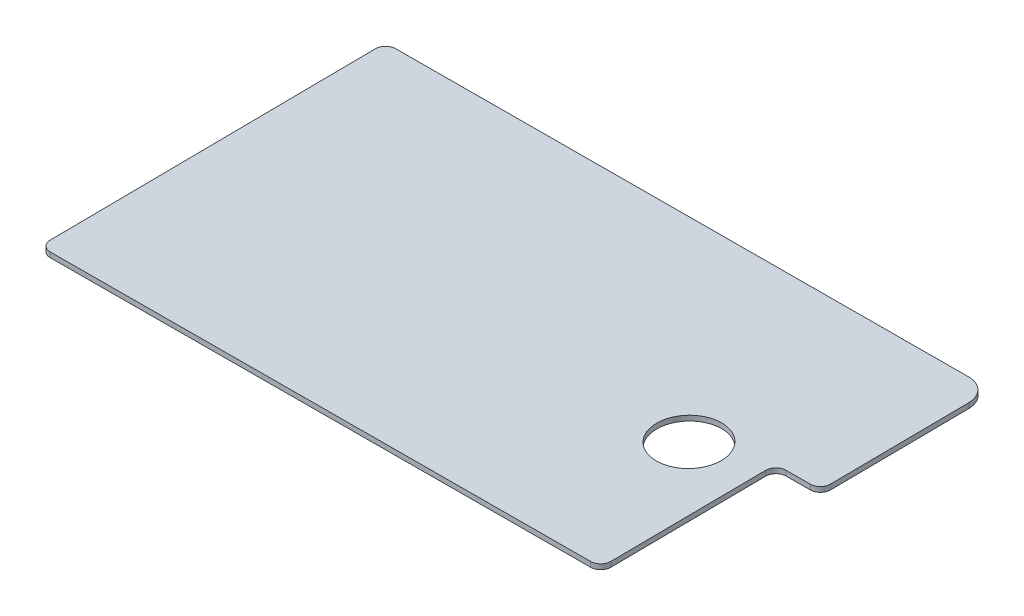
ISO-10303-21;
HEADER;
FILE_DESCRIPTION(('STEP AP214'),'2;1');
FILE_NAME('part.step','',(''),(''),'','','');
FILE_SCHEMA(('AUTOMOTIVE_DESIGN { 1 0 10303 214 1 1 1 1 }'));
ENDSEC;
DATA;
#1=APPLICATION_CONTEXT('core data for automotive mechanical design processes');
#2=APPLICATION_PROTOCOL_DEFINITION('international standard','automotive_design',2000,#1);
#3=PRODUCT_CONTEXT('',#1,'mechanical');
#4=PRODUCT('Part','Part','',(#3));
#5=PRODUCT_RELATED_PRODUCT_CATEGORY('part','',(#4));
#6=PRODUCT_DEFINITION_FORMATION('','',#4);
#7=PRODUCT_DEFINITION_CONTEXT('part definition',#1,'design');
#8=PRODUCT_DEFINITION('design','',#6,#7);
#9=PRODUCT_DEFINITION_SHAPE('','',#8);
#10=(LENGTH_UNIT() NAMED_UNIT(*) SI_UNIT(.MILLI.,.METRE.));
#11=(NAMED_UNIT(*) PLANE_ANGLE_UNIT() SI_UNIT($,.RADIAN.));
#12=(NAMED_UNIT(*) SI_UNIT($,.STERADIAN.) SOLID_ANGLE_UNIT());
#13=UNCERTAINTY_MEASURE_WITH_UNIT(LENGTH_MEASURE(1.E-05),#10,'distance_accuracy_value','');
#14=(GEOMETRIC_REPRESENTATION_CONTEXT(3) GLOBAL_UNCERTAINTY_ASSIGNED_CONTEXT((#13)) GLOBAL_UNIT_ASSIGNED_CONTEXT((#10,
#11,#12)) REPRESENTATION_CONTEXT('',''));
#15=CARTESIAN_POINT('',(0.,0.,0.));
#16=DIRECTION('',(0.,0.,1.));
#17=DIRECTION('',(1.,0.,0.));
#18=AXIS2_PLACEMENT_3D('',#15,#16,#17);
#19=CARTESIAN_POINT('',(179.345770116146,-1563.79459300671,-76.0416352237844));
#20=DIRECTION('',(-0.00401035269300453,0.999946047931856,0.00958218642790401));
#21=DIRECTION('',(-0.388528792529135,-0.0103875139856904,0.921378031499042));
#22=AXIS2_PLACEMENT_3D('',#19,#20,#21);
#23=PLANE('',#22);
#24=DIRECTION('',(-0.999991958318706,-0.00401035269300453,-1.92144919036807E-05));
#25=VECTOR('',#24,1.);
#26=CARTESIAN_POINT('',(236.14693968438,-1565.12535482206,86.6021155602221));
#27=LINE('',#26,#25);
#28=CARTESIAN_POINT('',(236.14693968438,-1565.12535482206,86.6021155602221));
#29=VERTEX_POINT('',#28);
#30=CARTESIAN_POINT('',(-101.670343674846,-1566.48013216881,86.5956245205672));
#31=VERTEX_POINT('',#30);
#32=EDGE_CURVE('E43',#29,#31,#27,.T.);
#33=ORIENTED_EDGE('',*,*,#32,.F.);
#34=CARTESIAN_POINT('',(236.146817672356,-1565.06450793824,80.2524070911787));
#35=DIRECTION('',(-0.00401035269300453,0.999946047931856,0.00958218642790401));
#36=DIRECTION('',(0.,-0.00958226348364413,0.999954089059358));
#37=AXIS2_PLACEMENT_3D('',#34,#35,#36);
#38=CIRCLE('',#37,6.34999999999994);
#39=CARTESIAN_POINT('',(242.49676660768,-1565.03904219864,80.2525291032023));
#40=VERTEX_POINT('',#39);
#41=EDGE_CURVE('E157',#29,#40,#38,.T.);
#42=ORIENTED_EDGE('',*,*,#41,.T.);
#43=DIRECTION('',(-1.92144919035644E-05,0.00958218642790401,-0.99995408961315));
#44=VECTOR('',#43,1.);
#45=CARTESIAN_POINT('',(242.49676660768,-1565.03904219864,80.2525291032023));
#46=LINE('',#45,#44);
#47=CARTESIAN_POINT('',(242.494909992659,-1564.11315608374,-16.3688019553789));
#48=VERTEX_POINT('',#47);
#49=EDGE_CURVE('E159',#40,#48,#46,.T.);
#50=ORIENTED_EDGE('',*,*,#49,.T.);
#51=CARTESIAN_POINT('',(248.844858927982,-1564.08769034414,-16.3686799433554));
#52=DIRECTION('',(-0.00401035269300453,0.999946047931856,0.00958218642790401));
#53=DIRECTION('',(0.,-0.00958226348364413,0.999954089059358));
#54=AXIS2_PLACEMENT_3D('',#51,#52,#53);
#55=CIRCLE('',#54,6.35000000000001);
#56=CARTESIAN_POINT('',(248.844736915959,-1564.02684346032,-22.7183884123989));
#57=VERTEX_POINT('',#56);
#58=EDGE_CURVE('E162',#48,#57,#55,.F.);
#59=ORIENTED_EDGE('',*,*,#58,.T.);
#60=DIRECTION('',(0.999991958318706,0.00401035269300454,1.92144919033824E-05));
#61=VECTOR('',#60,1.);
#62=CARTESIAN_POINT('',(248.844736915959,-1564.02684346032,-22.7183884123989));
#63=LINE('',#62,#61);
#64=CARTESIAN_POINT('',(264.084614360736,-1563.96572568528,-22.7180955835422));
#65=VERTEX_POINT('',#64);
#66=EDGE_CURVE('E164',#57,#65,#63,.T.);
#67=ORIENTED_EDGE('',*,*,#66,.T.);
#68=CARTESIAN_POINT('',(264.084492348712,-1563.90487880146,-29.0678040525857));
#69=DIRECTION('',(-0.00401035269300453,0.999946047931856,0.00958218642790401));
#70=DIRECTION('',(0.,-0.00958226348364413,0.999954089059358));
#71=AXIS2_PLACEMENT_3D('',#68,#69,#70);
#72=CIRCLE('',#71,6.35000000000001);
#73=CARTESIAN_POINT('',(270.434441284036,-1563.87941306186,-29.0676820405622));
#74=VERTEX_POINT('',#73);
#75=EDGE_CURVE('E166',#65,#74,#72,.T.);
#76=ORIENTED_EDGE('',*,*,#75,.T.);
#77=DIRECTION('',(1.92144919037876E-05,-0.00958218642790401,0.99995408961315));
#78=VECTOR('',#77,1.);
#79=CARTESIAN_POINT('',(270.432781920515,-1563.05189544195,-115.423717219554));
#80=LINE('',#79,#78);
#81=CARTESIAN_POINT('',(270.432781920515,-1563.05189544195,-115.423717219554));
#82=VERTEX_POINT('',#81);
#83=EDGE_CURVE('E169',#82,#74,#80,.T.);
#84=ORIENTED_EDGE('',*,*,#83,.F.);
#85=CARTESIAN_POINT('',(256.568660597189,-1563.10749590535,-115.423983613743));
#86=DIRECTION('',(-0.00401035269300453,0.999946047931856,0.00958218642790401));
#87=DIRECTION('',(0.,-0.00958226348364413,0.999954089059358));
#88=AXIS2_PLACEMENT_3D('',#85,#86,#87);
#89=CIRCLE('',#88,13.8642328150678);
#90=CARTESIAN_POINT('',(256.568394203,-1562.97464624184,-129.287579916519));
#91=VERTEX_POINT('',#90);
#92=EDGE_CURVE('E174',#91,#82,#89,.F.);
#93=ORIENTED_EDGE('',*,*,#92,.F.);
#94=DIRECTION('',(-0.999991958318706,-0.00401035269300453,-1.9214491903596E-05));
#95=VECTOR('',#94,1.);
#96=CARTESIAN_POINT('',(256.568394203,-1562.97464624184,-129.287579916519));
#97=LINE('',#96,#95);
#98=CARTESIAN_POINT('',(-101.674492083648,-1564.41133811903,-129.294463426912));
#99=VERTEX_POINT('',#98);
#100=EDGE_CURVE('E168',#91,#99,#97,.T.);
#101=ORIENTED_EDGE('',*,*,#100,.T.);
#102=CARTESIAN_POINT('',(-101.674370071624,-1564.47218500284,-122.944754957868));
#103=DIRECTION('',(-0.00401035269300453,0.999946047931856,0.00958218642790401));
#104=DIRECTION('',(0.,-0.00958226348364413,0.999954089059358));
#105=AXIS2_PLACEMENT_3D('',#102,#103,#104);
#106=CIRCLE('',#105,6.34999999999996);
#107=CARTESIAN_POINT('',(-108.024319006948,-1564.49765074245,-122.944876969892));
#108=VERTEX_POINT('',#107);
#109=EDGE_CURVE('E90',#99,#108,#106,.T.);
#110=ORIENTED_EDGE('',*,*,#109,.T.);
#111=DIRECTION('',(1.92144919038638E-05,-0.00958218642790401,0.99995408961315));
#112=VECTOR('',#111,1.);
#113=CARTESIAN_POINT('',(-108.024319006948,-1564.49765074245,-122.944876969892));
#114=LINE('',#113,#112);
#115=CARTESIAN_POINT('',(-108.020414622193,-1566.4447510246,80.2457940395002));
#116=VERTEX_POINT('',#115);
#117=EDGE_CURVE('E95',#108,#116,#114,.T.);
#118=ORIENTED_EDGE('',*,*,#117,.T.);
#119=CARTESIAN_POINT('',(-101.670465686869,-1566.41928528499,80.2459160515237));
#120=DIRECTION('',(-0.00401035269300453,0.999946047931856,0.00958218642790401));
#121=DIRECTION('',(0.,-0.00958226348364413,0.999954089059358));
#122=AXIS2_PLACEMENT_3D('',#119,#120,#121);
#123=CIRCLE('',#122,6.34999999999996);
#124=EDGE_CURVE('E134',#31,#116,#123,.F.);
#125=ORIENTED_EDGE('',*,*,#124,.F.);
#126=EDGE_LOOP('',(#33,#42,#50,#59,#67,#76,#84,#93,#101,#110,#118,#125));
#127=FACE_BOUND('',#126,.T.);
#128=CARTESIAN_POINT('',(202.890853379791,-1564.35154294354,-8.06717227578847));
#129=DIRECTION('',(-0.00401035269300453,0.999946047931856,0.00958218642790401));
#130=DIRECTION('',(0.,-0.00958226348364413,0.999954089059358));
#131=AXIS2_PLACEMENT_3D('',#128,#129,#130);
#132=CIRCLE('',#131,20.32);
#133=CARTESIAN_POINT('',(202.890853379791,-1564.54625453753,12.2518948138977));
#134=VERTEX_POINT('',#133);
#135=EDGE_CURVE('E160',#134,#134,#132,.T.);
#136=ORIENTED_EDGE('',*,*,#135,.F.);
#137=EDGE_LOOP('',(#136));
#138=FACE_BOUND('',#137,.T.);
#139=ADVANCED_FACE('F35',(#127,#138),#23,.T.);
#140=CARTESIAN_POINT('',(-101.657732817069,-1569.59411398718,80.2154926096152));
#141=DIRECTION('',(0.00401035269300462,-0.999946047931856,-0.00958218642790412));
#142=DIRECTION('',(0.,0.00958226348364424,-0.999954089059358));
#143=AXIS2_PLACEMENT_3D('',#140,#141,#142);
#144=PLANE('',#143);
#145=DIRECTION('',(-0.999991958318706,-0.00401035269300463,-1.92144919036816E-05));
#146=VECTOR('',#145,1.);
#147=CARTESIAN_POINT('',(236.15967255418,-1568.30018352424,86.5716921183135));
#148=LINE('',#147,#146);
#149=CARTESIAN_POINT('',(236.15967255418,-1568.30018352424,86.5716921183135));
#150=VERTEX_POINT('',#149);
#151=CARTESIAN_POINT('',(-101.657610805045,-1569.65496087099,86.5652010786586));
#152=VERTEX_POINT('',#151);
#153=EDGE_CURVE('E145',#150,#152,#148,.T.);
#154=ORIENTED_EDGE('',*,*,#153,.T.);
#155=CARTESIAN_POINT('',(-101.657732817069,-1569.59411398718,80.2154926096152));
#156=DIRECTION('',(0.00401035269300462,-0.999946047931856,-0.00958218642790412));
#157=DIRECTION('',(0.,0.00958226348364424,-0.999954089059358));
#158=AXIS2_PLACEMENT_3D('',#155,#156,#157);
#159=CIRCLE('',#158,6.34999999999996);
#160=CARTESIAN_POINT('',(-108.007681752393,-1569.61957972678,80.2153705975916));
#161=VERTEX_POINT('',#160);
#162=EDGE_CURVE('E132',#152,#161,#159,.T.);
#163=ORIENTED_EDGE('',*,*,#162,.T.);
#164=DIRECTION('',(1.92144919038675E-05,-0.00958218642790493,0.99995408961315));
#165=VECTOR('',#164,1.);
#166=CARTESIAN_POINT('',(-108.011586137148,-1567.67247944463,-122.975300411801));
#167=LINE('',#166,#165);
#168=CARTESIAN_POINT('',(-108.011586137148,-1567.67247944463,-122.975300411801));
#169=VERTEX_POINT('',#168);
#170=EDGE_CURVE('E136',#169,#161,#167,.T.);
#171=ORIENTED_EDGE('',*,*,#170,.F.);
#172=CARTESIAN_POINT('',(-101.661637201824,-1567.64701370503,-122.975178399777));
#173=DIRECTION('',(-0.00401035269300462,0.999946047931856,0.00958218642790412));
#174=DIRECTION('',(0.,-0.00958226348364424,0.999954089059358));
#175=AXIS2_PLACEMENT_3D('',#172,#173,#174);
#176=CIRCLE('',#175,6.34999999999996);
#177=CARTESIAN_POINT('',(-101.661759213847,-1567.58616682121,-129.324886868821));
#178=VERTEX_POINT('',#177);
#179=EDGE_CURVE('E199',#178,#169,#176,.T.);
#180=ORIENTED_EDGE('',*,*,#179,.F.);
#181=DIRECTION('',(-0.999991958318706,-0.00401035269300506,-1.9214491903601E-05));
#182=VECTOR('',#181,1.);
#183=CARTESIAN_POINT('',(256.5811270728,-1566.14947494402,-129.318003358427));
#184=LINE('',#183,#182);
#185=CARTESIAN_POINT('',(256.5811270728,-1566.14947494402,-129.318003358427));
#186=VERTEX_POINT('',#185);
#187=EDGE_CURVE('E177',#186,#178,#184,.T.);
#188=ORIENTED_EDGE('',*,*,#187,.F.);
#189=CARTESIAN_POINT('',(256.581393466989,-1566.28232460754,-115.454407055652));
#190=DIRECTION('',(0.00401035269300462,-0.999946047931856,-0.00958218642790412));
#191=DIRECTION('',(0.,0.00958226348364424,-0.999954089059358));
#192=AXIS2_PLACEMENT_3D('',#189,#190,#191);
#193=CIRCLE('',#192,13.8642328150678);
#194=CARTESIAN_POINT('',(270.445514790316,-1566.22672414413,-115.454140661462));
#195=VERTEX_POINT('',#194);
#196=EDGE_CURVE('E146',#186,#195,#193,.T.);
#197=ORIENTED_EDGE('',*,*,#196,.T.);
#198=DIRECTION('',(1.92144919037952E-05,-0.0095821864279059,0.99995408961315));
#199=VECTOR('',#198,1.);
#200=CARTESIAN_POINT('',(270.445514790315,-1566.22672414413,-115.454140661462));
#201=LINE('',#200,#199);
#202=CARTESIAN_POINT('',(270.447174153836,-1567.05424176404,-29.0981054824707));
#203=VERTEX_POINT('',#202);
#204=EDGE_CURVE('E149',#195,#203,#201,.T.);
#205=ORIENTED_EDGE('',*,*,#204,.T.);
#206=CARTESIAN_POINT('',(264.097225218512,-1567.07970750364,-29.0982274944943));
#207=DIRECTION('',(-0.00401035269300462,0.999946047931856,0.00958218642790412));
#208=DIRECTION('',(0.,-0.00958226348364424,0.999954089059358));
#209=AXIS2_PLACEMENT_3D('',#206,#207,#208);
#210=CIRCLE('',#209,6.35000000000001);
#211=CARTESIAN_POINT('',(264.097347230536,-1567.14055438746,-22.7485190254508));
#212=VERTEX_POINT('',#211);
#213=EDGE_CURVE('E192',#212,#203,#210,.T.);
#214=ORIENTED_EDGE('',*,*,#213,.F.);
#215=DIRECTION('',(0.999991958318706,0.0040103526930029,1.92144919033668E-05));
#216=VECTOR('',#215,1.);
#217=CARTESIAN_POINT('',(248.857469785759,-1567.2016721625,-22.7488118543074));
#218=LINE('',#217,#216);
#219=CARTESIAN_POINT('',(248.857469785759,-1567.2016721625,-22.7488118543074));
#220=VERTEX_POINT('',#219);
#221=EDGE_CURVE('E189',#220,#212,#218,.T.);
#222=ORIENTED_EDGE('',*,*,#221,.F.);
#223=CARTESIAN_POINT('',(248.857591797783,-1567.26251904632,-16.3991033852639));
#224=DIRECTION('',(0.00401035269300462,-0.999946047931856,-0.00958218642790412));
#225=DIRECTION('',(0.,0.00958226348364424,-0.999954089059358));
#226=AXIS2_PLACEMENT_3D('',#223,#224,#225);
#227=CIRCLE('',#226,6.35000000000001);
#228=CARTESIAN_POINT('',(242.507642862459,-1567.28798478592,-16.3992253972875));
#229=VERTEX_POINT('',#228);
#230=EDGE_CURVE('E186',#229,#220,#227,.T.);
#231=ORIENTED_EDGE('',*,*,#230,.F.);
#232=DIRECTION('',(-1.92144919035654E-05,0.00958218642790425,-0.99995408961315));
#233=VECTOR('',#232,1.);
#234=CARTESIAN_POINT('',(242.50949947748,-1568.21387090083,80.2221056612937));
#235=LINE('',#234,#233);
#236=CARTESIAN_POINT('',(242.50949947748,-1568.21387090083,80.2221056612937));
#237=VERTEX_POINT('',#236);
#238=EDGE_CURVE('E183',#237,#229,#235,.T.);
#239=ORIENTED_EDGE('',*,*,#238,.F.);
#240=CARTESIAN_POINT('',(236.159550542156,-1568.23933664043,80.2219836492701));
#241=DIRECTION('',(-0.00401035269300462,0.999946047931856,0.00958218642790412));
#242=DIRECTION('',(0.,-0.00958226348364424,0.999954089059358));
#243=AXIS2_PLACEMENT_3D('',#240,#241,#242);
#244=CIRCLE('',#243,6.34999999999994);
#245=EDGE_CURVE('E156',#150,#237,#244,.T.);
#246=ORIENTED_EDGE('',*,*,#245,.F.);
#247=EDGE_LOOP('',(#154,#163,#171,#180,#188,#197,#205,#214,#222,#231,#239,#246));
#248=FACE_BOUND('',#247,.T.);
#249=CARTESIAN_POINT('',(202.903586249591,-1567.52637164572,-8.09759571769707));
#250=DIRECTION('',(-0.00401035269300462,0.999946047931856,0.00958218642790412));
#251=DIRECTION('',(0.,-0.00958226348364425,0.999954089059358));
#252=AXIS2_PLACEMENT_3D('',#249,#250,#251);
#253=CIRCLE('',#252,20.32);
#254=CARTESIAN_POINT('',(202.903586249591,-1567.72108323971,12.2214713719891));
#255=VERTEX_POINT('',#254);
#256=EDGE_CURVE('E220',#255,#255,#253,.T.);
#257=ORIENTED_EDGE('',*,*,#256,.T.);
#258=EDGE_LOOP('',(#257));
#259=FACE_BOUND('',#258,.T.);
#260=ADVANCED_FACE('F142',(#248,#259),#144,.T.);
#261=CARTESIAN_POINT('',(-103.41791796168,-1130.70748387809,84.4212130273496));
#262=DIRECTION('',(0.00401035269300462,-0.999946047931856,-0.00958218642790412));
#263=DIRECTION('',(0.,0.00958226348364424,-0.999954089059358));
#264=AXIS2_PLACEMENT_3D('',#261,#262,#263);
#265=CYLINDRICAL_SURFACE('',#264,6.34999999999996);
#266=DIRECTION('',(0.00401035269300462,-0.999946047931856,-0.00958218642790412));
#267=VECTOR('',#266,1.);
#268=CARTESIAN_POINT('',(-103.417795949656,-1130.76833076191,90.7709214963931));
#269=LINE('',#268,#267);
#270=EDGE_CURVE('E11',#31,#152,#269,.T.);
#271=ORIENTED_EDGE('',*,*,#270,.F.);
#272=ORIENTED_EDGE('',*,*,#124,.T.);
#273=DIRECTION('',(0.00401035269300462,-0.999946047931856,-0.00958218642790412));
#274=VECTOR('',#273,1.);
#275=CARTESIAN_POINT('',(-109.767866897003,-1130.73294961769,84.421091015326));
#276=LINE('',#275,#274);
#277=EDGE_CURVE('E129',#116,#161,#276,.T.);
#278=ORIENTED_EDGE('',*,*,#277,.T.);
#279=ORIENTED_EDGE('',*,*,#162,.F.);
#280=EDGE_LOOP('',(#271,#272,#278,#279));
#281=FACE_BOUND('',#280,.T.);
#282=ADVANCED_FACE('F130',(#281),#265,.T.);
#283=CARTESIAN_POINT('',(-109.771771281758,-1128.78584933554,-118.769579994066));
#284=DIRECTION('',(0.999991958318706,0.00401035269300462,1.92144919037299E-05));
#285=DIRECTION('',(-0.00401035269374493,0.999991958503303,0.));
#286=AXIS2_PLACEMENT_3D('',#283,#284,#285);
#287=PLANE('',#286);
#288=ORIENTED_EDGE('',*,*,#117,.F.);
#289=DIRECTION('',(0.00401035269300462,-0.999946047931856,-0.00958218642790412));
#290=VECTOR('',#289,1.);
#291=CARTESIAN_POINT('',(-109.771771281758,-1128.78584933554,-118.769579994066));
#292=LINE('',#291,#290);
#293=EDGE_CURVE('E124',#108,#169,#292,.T.);
#294=ORIENTED_EDGE('',*,*,#293,.T.);
#295=ORIENTED_EDGE('',*,*,#170,.T.);
#296=ORIENTED_EDGE('',*,*,#277,.F.);
#297=EDGE_LOOP('',(#288,#294,#295,#296));
#298=FACE_BOUND('',#297,.T.);
#299=ADVANCED_FACE('F137',(#298),#287,.F.);
#300=CARTESIAN_POINT('',(-103.421822346434,-1128.76038359594,-118.769457982043));
#301=DIRECTION('',(0.00401035269300462,-0.999946047931856,-0.00958218642790412));
#302=DIRECTION('',(0.,0.00958226348364424,-0.999954089059358));
#303=AXIS2_PLACEMENT_3D('',#300,#301,#302);
#304=CYLINDRICAL_SURFACE('',#303,6.34999999999996);
#305=ORIENTED_EDGE('',*,*,#109,.F.);
#306=DIRECTION('',(0.00401035269300462,-0.999946047931856,-0.00958218642790412));
#307=VECTOR('',#306,1.);
#308=CARTESIAN_POINT('',(-103.421944358458,-1128.69953671212,-125.119166451086));
#309=LINE('',#308,#307);
#310=EDGE_CURVE('E140',#99,#178,#309,.T.);
#311=ORIENTED_EDGE('',*,*,#310,.T.);
#312=ORIENTED_EDGE('',*,*,#179,.T.);
#313=ORIENTED_EDGE('',*,*,#293,.F.);
#314=EDGE_LOOP('',(#305,#311,#312,#313));
#315=FACE_BOUND('',#314,.T.);
#316=ADVANCED_FACE('F273',(#315),#304,.T.);
#317=CARTESIAN_POINT('',(254.82094192819,-1127.26284483494,-125.112282940693));
#318=DIRECTION('',(1.92144919039973E-05,-0.00958218642790411,0.99995408961315));
#319=DIRECTION('',(0.,-0.99995408979774,-0.00958218642967297));
#320=AXIS2_PLACEMENT_3D('',#317,#318,#319);
#321=PLANE('',#320);
#322=ORIENTED_EDGE('',*,*,#100,.F.);
#323=DIRECTION('',(0.00401035269300462,-0.999946047931856,-0.00958218642790412));
#324=VECTOR('',#323,1.);
#325=CARTESIAN_POINT('',(254.82094192819,-1127.26284483494,-125.112282940693));
#326=LINE('',#325,#324);
#327=EDGE_CURVE('E197',#91,#186,#326,.T.);
#328=ORIENTED_EDGE('',*,*,#327,.T.);
#329=ORIENTED_EDGE('',*,*,#187,.T.);
#330=ORIENTED_EDGE('',*,*,#310,.F.);
#331=EDGE_LOOP('',(#322,#328,#329,#330));
#332=FACE_BOUND('',#331,.T.);
#333=ADVANCED_FACE('F272',(#332),#321,.F.);
#334=CARTESIAN_POINT('',(254.821208322379,-1127.39569449845,-111.248686637917));
#335=DIRECTION('',(0.00401035269300462,-0.999946047931856,-0.00958218642790412));
#336=DIRECTION('',(0.,0.00958226348364424,-0.999954089059358));
#337=AXIS2_PLACEMENT_3D('',#334,#335,#336);
#338=CYLINDRICAL_SURFACE('',#337,13.8642328150678);
#339=ORIENTED_EDGE('',*,*,#327,.F.);
#340=ORIENTED_EDGE('',*,*,#92,.T.);
#341=DIRECTION('',(0.00401035269300462,-0.999946047931856,-0.00958218642790412));
#342=VECTOR('',#341,1.);
#343=CARTESIAN_POINT('',(268.685329645705,-1127.34009403504,-111.248420243728));
#344=LINE('',#343,#342);
#345=EDGE_CURVE('E173',#82,#195,#344,.T.);
#346=ORIENTED_EDGE('',*,*,#345,.T.);
#347=ORIENTED_EDGE('',*,*,#196,.F.);
#348=EDGE_LOOP('',(#339,#340,#346,#347));
#349=FACE_BOUND('',#348,.T.);
#350=ADVANCED_FACE('F268',(#349),#338,.T.);
#351=CARTESIAN_POINT('',(268.685329645705,-1127.34009403504,-111.248420243728));
#352=DIRECTION('',(0.999991958318706,0.00401035269300462,1.92144919038061E-05));
#353=DIRECTION('',(-0.00401035269374493,0.999991958503303,0.));
#354=AXIS2_PLACEMENT_3D('',#351,#352,#353);
#355=PLANE('',#354);
#356=ORIENTED_EDGE('',*,*,#345,.F.);
#357=ORIENTED_EDGE('',*,*,#83,.T.);
#358=DIRECTION('',(0.00401035269300462,-0.999946047931856,-0.00958218642790412));
#359=VECTOR('',#358,1.);
#360=CARTESIAN_POINT('',(268.686989009226,-1128.16761165496,-24.8923850647363));
#361=LINE('',#360,#359);
#362=EDGE_CURVE('E172',#74,#203,#361,.T.);
#363=ORIENTED_EDGE('',*,*,#362,.T.);
#364=ORIENTED_EDGE('',*,*,#204,.F.);
#365=EDGE_LOOP('',(#356,#357,#363,#364));
#366=FACE_BOUND('',#365,.T.);
#367=ADVANCED_FACE('F265',(#366),#355,.T.);
#368=CARTESIAN_POINT('',(262.337040073902,-1128.19307739456,-24.8925070767599));
#369=DIRECTION('',(0.00401035269300462,-0.999946047931856,-0.00958218642790412));
#370=DIRECTION('',(0.,0.00958226348364424,-0.999954089059358));
#371=AXIS2_PLACEMENT_3D('',#368,#369,#370);
#372=CYLINDRICAL_SURFACE('',#371,6.35000000000001);
#373=ORIENTED_EDGE('',*,*,#75,.F.);
#374=DIRECTION('',(0.00401035269300462,-0.999946047931856,-0.00958218642790412));
#375=VECTOR('',#374,1.);
#376=CARTESIAN_POINT('',(262.337162085926,-1128.25392427838,-18.5427986077164));
#377=LINE('',#376,#375);
#378=EDGE_CURVE('E193',#65,#212,#377,.T.);
#379=ORIENTED_EDGE('',*,*,#378,.T.);
#380=ORIENTED_EDGE('',*,*,#213,.T.);
#381=ORIENTED_EDGE('',*,*,#362,.F.);
#382=EDGE_LOOP('',(#373,#379,#380,#381));
#383=FACE_BOUND('',#382,.T.);
#384=ADVANCED_FACE('F260',(#383),#372,.T.);
#385=CARTESIAN_POINT('',(247.097284641149,-1128.31504205342,-18.543091436573));
#386=DIRECTION('',(-1.92144919042109E-05,0.00958218642790412,-0.99995408961315));
#387=DIRECTION('',(0.,0.99995408979774,0.00958218642967297));
#388=AXIS2_PLACEMENT_3D('',#385,#386,#387);
#389=PLANE('',#388);
#390=ORIENTED_EDGE('',*,*,#66,.F.);
#391=DIRECTION('',(0.00401035269300462,-0.999946047931856,-0.00958218642790412));
#392=VECTOR('',#391,1.);
#393=CARTESIAN_POINT('',(247.097284641149,-1128.31504205342,-18.543091436573));
#394=LINE('',#393,#392);
#395=EDGE_CURVE('E190',#57,#220,#394,.T.);
#396=ORIENTED_EDGE('',*,*,#395,.T.);
#397=ORIENTED_EDGE('',*,*,#221,.T.);
#398=ORIENTED_EDGE('',*,*,#378,.F.);
#399=EDGE_LOOP('',(#390,#396,#397,#398));
#400=FACE_BOUND('',#399,.T.);
#401=ADVANCED_FACE('F255',(#400),#389,.F.);
#402=CARTESIAN_POINT('',(247.097406653172,-1128.37588893723,-12.1933829675295));
#403=DIRECTION('',(0.00401035269300462,-0.999946047931856,-0.00958218642790412));
#404=DIRECTION('',(0.,0.00958226348364424,-0.999954089059358));
#405=AXIS2_PLACEMENT_3D('',#402,#403,#404);
#406=CYLINDRICAL_SURFACE('',#405,6.35000000000001);
#407=ORIENTED_EDGE('',*,*,#58,.F.);
#408=DIRECTION('',(0.00401035269300462,-0.999946047931856,-0.00958218642790412));
#409=VECTOR('',#408,1.);
#410=CARTESIAN_POINT('',(240.747457717848,-1128.40135467683,-12.1935049795531));
#411=LINE('',#410,#409);
#412=EDGE_CURVE('E187',#48,#229,#411,.T.);
#413=ORIENTED_EDGE('',*,*,#412,.T.);
#414=ORIENTED_EDGE('',*,*,#230,.T.);
#415=ORIENTED_EDGE('',*,*,#395,.F.);
#416=EDGE_LOOP('',(#407,#413,#414,#415));
#417=FACE_BOUND('',#416,.T.);
#418=ADVANCED_FACE('F251',(#417),#406,.F.);
#419=CARTESIAN_POINT('',(240.74931433287,-1129.32724079174,84.4278260790281));
#420=DIRECTION('',(-0.999991958318706,-0.00401035269300462,-1.92144919040293E-05));
#421=DIRECTION('',(0.00401035269374493,-0.999991958503303,0.));
#422=AXIS2_PLACEMENT_3D('',#419,#420,#421);
#423=PLANE('',#422);
#424=ORIENTED_EDGE('',*,*,#49,.F.);
#425=DIRECTION('',(0.00401035269300462,-0.999946047931856,-0.00958218642790412));
#426=VECTOR('',#425,1.);
#427=CARTESIAN_POINT('',(240.74931433287,-1129.32724079174,84.4278260790281));
#428=LINE('',#427,#426);
#429=EDGE_CURVE('E184',#40,#237,#428,.T.);
#430=ORIENTED_EDGE('',*,*,#429,.T.);
#431=ORIENTED_EDGE('',*,*,#238,.T.);
#432=ORIENTED_EDGE('',*,*,#412,.F.);
#433=EDGE_LOOP('',(#424,#430,#431,#432));
#434=FACE_BOUND('',#433,.T.);
#435=ADVANCED_FACE('F245',(#434),#423,.F.);
#436=CARTESIAN_POINT('',(234.399365397546,-1129.35270653134,84.4277040670045));
#437=DIRECTION('',(0.00401035269300462,-0.999946047931856,-0.00958218642790412));
#438=DIRECTION('',(0.,0.00958226348364424,-0.999954089059358));
#439=AXIS2_PLACEMENT_3D('',#436,#437,#438);
#440=CYLINDRICAL_SURFACE('',#439,6.34999999999994);
#441=ORIENTED_EDGE('',*,*,#41,.F.);
#442=DIRECTION('',(0.00401035269300462,-0.999946047931856,-0.00958218642790412));
#443=VECTOR('',#442,1.);
#444=CARTESIAN_POINT('',(234.399487409569,-1129.41355341516,90.777412536048));
#445=LINE('',#444,#443);
#446=EDGE_CURVE('E181',#29,#150,#445,.T.);
#447=ORIENTED_EDGE('',*,*,#446,.T.);
#448=ORIENTED_EDGE('',*,*,#245,.T.);
#449=ORIENTED_EDGE('',*,*,#429,.F.);
#450=EDGE_LOOP('',(#441,#447,#448,#449));
#451=FACE_BOUND('',#450,.T.);
#452=ADVANCED_FACE('F240',(#451),#440,.T.);
#453=CARTESIAN_POINT('',(234.399487409569,-1129.41355341516,90.777412536048));
#454=DIRECTION('',(1.92144919039126E-05,-0.00958218642790412,0.99995408961315));
#455=DIRECTION('',(0.,-0.99995408979774,-0.00958218642967297));
#456=AXIS2_PLACEMENT_3D('',#453,#454,#455);
#457=PLANE('',#456);
#458=ORIENTED_EDGE('',*,*,#446,.F.);
#459=ORIENTED_EDGE('',*,*,#32,.T.);
#460=ORIENTED_EDGE('',*,*,#270,.T.);
#461=ORIENTED_EDGE('',*,*,#153,.F.);
#462=EDGE_LOOP('',(#458,#459,#460,#461));
#463=FACE_BOUND('',#462,.T.);
#464=ADVANCED_FACE('F227',(#463),#457,.T.);
#465=CARTESIAN_POINT('',(202.660363816149,-1506.88100459039,-7.51644915052504));
#466=DIRECTION('',(0.00401035269300463,-0.999946047931857,-0.00958218642790412));
#467=DIRECTION('',(0.,0.00958226348364425,-0.999954089059358));
#468=AXIS2_PLACEMENT_3D('',#465,#466,#467);
#469=CYLINDRICAL_SURFACE('',#468,20.32);
#470=ORIENTED_EDGE('',*,*,#256,.F.);
#471=EDGE_LOOP('',(#470));
#472=FACE_BOUND('',#471,.T.);
#473=ORIENTED_EDGE('',*,*,#135,.T.);
#474=EDGE_LOOP('',(#473));
#475=FACE_BOUND('',#474,.T.);
#476=ADVANCED_FACE('F224',(#472,#475),#469,.F.);
#477=CLOSED_SHELL('',(#139,#260,#282,#299,#316,#333,#350,#367,#384,#401,#418,#435,#452,#464,#476));
#478=MANIFOLD_SOLID_BREP('B2',#477);
#479=ADVANCED_BREP_SHAPE_REPRESENTATION('',(#18,#478),#14);
#480=SHAPE_DEFINITION_REPRESENTATION(#9,#479);
ENDSEC;
END-ISO-10303-21;
